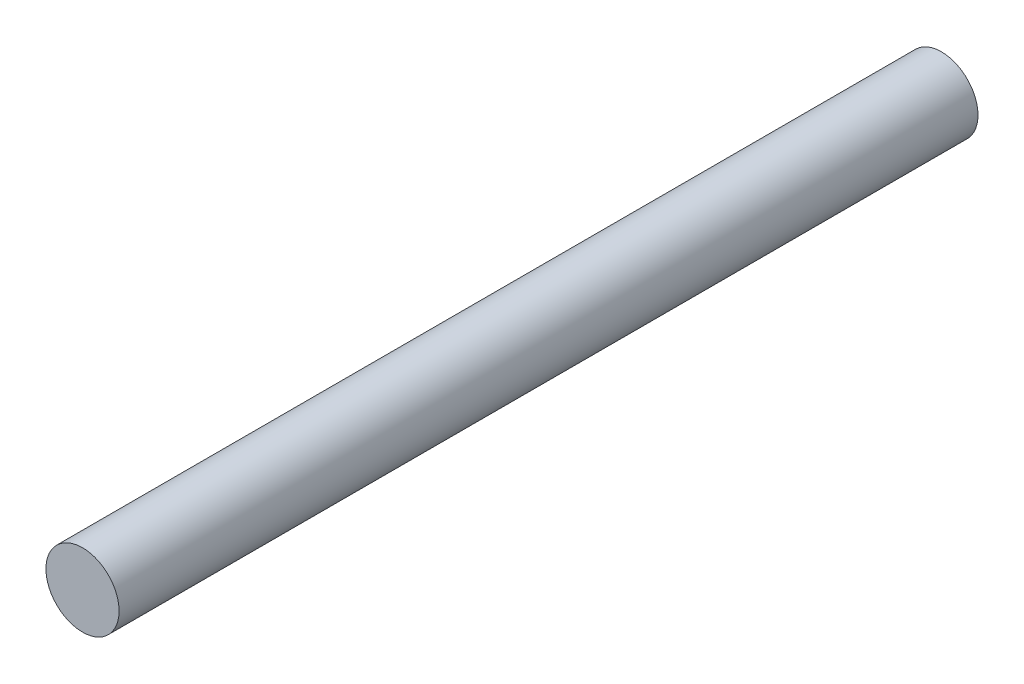
ISO-10303-21;
HEADER;
FILE_DESCRIPTION(('STEP AP214'),'2;1');
FILE_NAME('part.step','',(''),(''),'','','');
FILE_SCHEMA(('AUTOMOTIVE_DESIGN { 1 0 10303 214 1 1 1 1 }'));
ENDSEC;
DATA;
#1=APPLICATION_CONTEXT('core data for automotive mechanical design processes');
#2=APPLICATION_PROTOCOL_DEFINITION('international standard','automotive_design',2000,#1);
#3=PRODUCT_CONTEXT('',#1,'mechanical');
#4=PRODUCT('Part','Part','',(#3));
#5=PRODUCT_RELATED_PRODUCT_CATEGORY('part','',(#4));
#6=PRODUCT_DEFINITION_FORMATION('','',#4);
#7=PRODUCT_DEFINITION_CONTEXT('part definition',#1,'design');
#8=PRODUCT_DEFINITION('design','',#6,#7);
#9=PRODUCT_DEFINITION_SHAPE('','',#8);
#10=(LENGTH_UNIT() NAMED_UNIT(*) SI_UNIT(.MILLI.,.METRE.));
#11=(NAMED_UNIT(*) PLANE_ANGLE_UNIT() SI_UNIT($,.RADIAN.));
#12=(NAMED_UNIT(*) SI_UNIT($,.STERADIAN.) SOLID_ANGLE_UNIT());
#13=UNCERTAINTY_MEASURE_WITH_UNIT(LENGTH_MEASURE(1.E-05),#10,'distance_accuracy_value','');
#14=(GEOMETRIC_REPRESENTATION_CONTEXT(3) GLOBAL_UNCERTAINTY_ASSIGNED_CONTEXT((#13)) GLOBAL_UNIT_ASSIGNED_CONTEXT((#10,
#11,#12)) REPRESENTATION_CONTEXT('',''));
#15=CARTESIAN_POINT('',(0.,0.,0.));
#16=DIRECTION('',(0.,0.,1.));
#17=DIRECTION('',(1.,0.,0.));
#18=AXIS2_PLACEMENT_3D('',#15,#16,#17);
#19=CARTESIAN_POINT('',(0.,0.,44.45));
#20=DIRECTION('',(0.,0.,-1.));
#21=DIRECTION('',(-1.,0.,0.));
#22=AXIS2_PLACEMENT_3D('',#19,#20,#21);
#23=CYLINDRICAL_SURFACE('',#22,1.8923);
#24=CARTESIAN_POINT('',(0.,0.,44.45));
#25=DIRECTION('',(0.,0.,1.));
#26=DIRECTION('',(1.,0.,0.));
#27=AXIS2_PLACEMENT_3D('',#24,#25,#26);
#28=CIRCLE('',#27,1.8923);
#29=CARTESIAN_POINT('',(1.8923,0.,44.45));
#30=VERTEX_POINT('',#29);
#31=EDGE_CURVE('E10',#30,#30,#28,.T.);
#32=ORIENTED_EDGE('',*,*,#31,.F.);
#33=EDGE_LOOP('',(#32));
#34=FACE_BOUND('',#33,.T.);
#35=CARTESIAN_POINT('',(0.,0.,0.));
#36=DIRECTION('',(0.,0.,1.));
#37=DIRECTION('',(1.,0.,0.));
#38=AXIS2_PLACEMENT_3D('',#35,#36,#37);
#39=CIRCLE('',#38,1.8923);
#40=CARTESIAN_POINT('',(1.8923,0.,0.));
#41=VERTEX_POINT('',#40);
#42=EDGE_CURVE('E36',#41,#41,#39,.T.);
#43=ORIENTED_EDGE('',*,*,#42,.T.);
#44=EDGE_LOOP('',(#43));
#45=FACE_BOUND('',#44,.T.);
#46=ADVANCED_FACE('F33',(#34,#45),#23,.T.);
#47=CARTESIAN_POINT('',(0.,0.,44.45));
#48=DIRECTION('',(0.,0.,1.));
#49=DIRECTION('',(1.,0.,0.));
#50=AXIS2_PLACEMENT_3D('',#47,#48,#49);
#51=PLANE('',#50);
#52=ORIENTED_EDGE('',*,*,#31,.T.);
#53=EDGE_LOOP('',(#52));
#54=FACE_BOUND('',#53,.T.);
#55=ADVANCED_FACE('F48',(#54),#51,.T.);
#56=CARTESIAN_POINT('',(0.,0.,0.));
#57=DIRECTION('',(0.,0.,1.));
#58=DIRECTION('',(1.,0.,0.));
#59=AXIS2_PLACEMENT_3D('',#56,#57,#58);
#60=PLANE('',#59);
#61=ORIENTED_EDGE('',*,*,#42,.F.);
#62=EDGE_LOOP('',(#61));
#63=FACE_BOUND('',#62,.T.);
#64=ADVANCED_FACE('F46',(#63),#60,.F.);
#65=CLOSED_SHELL('',(#46,#55,#64));
#66=MANIFOLD_SOLID_BREP('B2',#65);
#67=ADVANCED_BREP_SHAPE_REPRESENTATION('',(#18,#66),#14);
#68=SHAPE_DEFINITION_REPRESENTATION(#9,#67);
ENDSEC;
END-ISO-10303-21;
